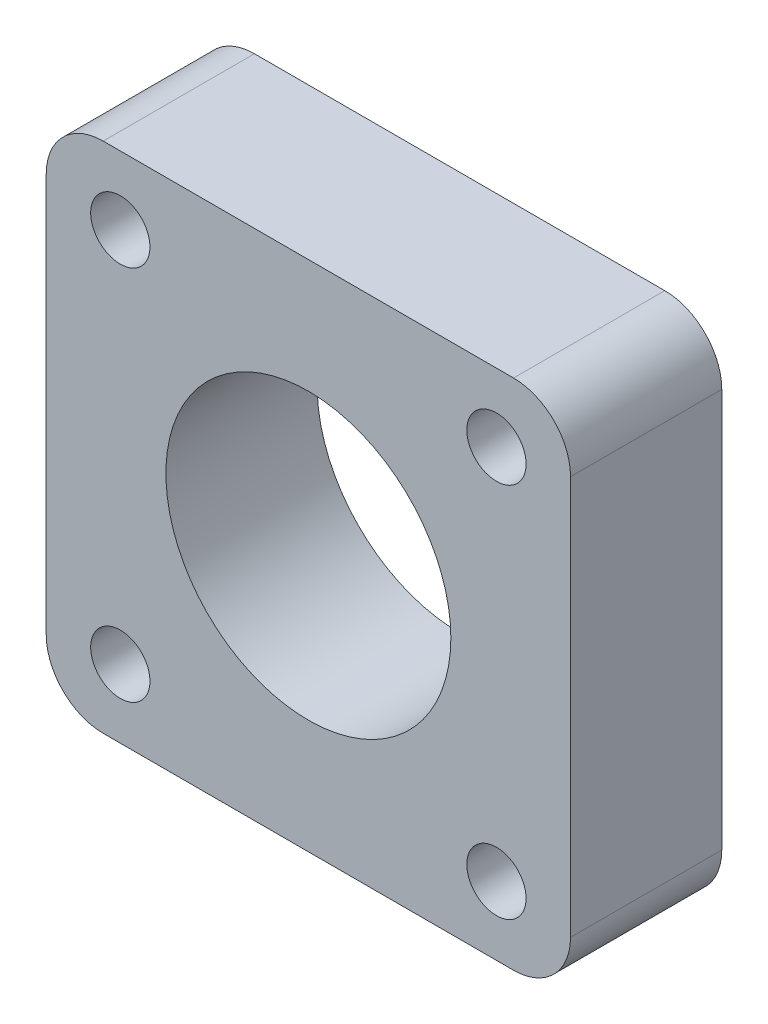
ISO-10303-21;
HEADER;
FILE_DESCRIPTION(('STEP AP214'),'2;1');
FILE_NAME('part.step','',(''),(''),'','','');
FILE_SCHEMA(('AUTOMOTIVE_DESIGN { 1 0 10303 214 1 1 1 1 }'));
ENDSEC;
DATA;
#1=APPLICATION_CONTEXT('core data for automotive mechanical design processes');
#2=APPLICATION_PROTOCOL_DEFINITION('international standard','automotive_design',2000,#1);
#3=PRODUCT_CONTEXT('',#1,'mechanical');
#4=PRODUCT('Part','Part','',(#3));
#5=PRODUCT_RELATED_PRODUCT_CATEGORY('part','',(#4));
#6=PRODUCT_DEFINITION_FORMATION('','',#4);
#7=PRODUCT_DEFINITION_CONTEXT('part definition',#1,'design');
#8=PRODUCT_DEFINITION('design','',#6,#7);
#9=PRODUCT_DEFINITION_SHAPE('','',#8);
#10=(LENGTH_UNIT() NAMED_UNIT(*) SI_UNIT(.MILLI.,.METRE.));
#11=(NAMED_UNIT(*) PLANE_ANGLE_UNIT() SI_UNIT($,.RADIAN.));
#12=(NAMED_UNIT(*) SI_UNIT($,.STERADIAN.) SOLID_ANGLE_UNIT());
#13=UNCERTAINTY_MEASURE_WITH_UNIT(LENGTH_MEASURE(1.E-05),#10,'distance_accuracy_value','');
#14=(GEOMETRIC_REPRESENTATION_CONTEXT(3) GLOBAL_UNCERTAINTY_ASSIGNED_CONTEXT((#13)) GLOBAL_UNIT_ASSIGNED_CONTEXT((#10,
#11,#12)) REPRESENTATION_CONTEXT('',''));
#15=CARTESIAN_POINT('',(0.,0.,0.));
#16=DIRECTION('',(0.,0.,1.));
#17=DIRECTION('',(1.,0.,0.));
#18=AXIS2_PLACEMENT_3D('',#15,#16,#17);
#19=CARTESIAN_POINT('',(119.085323537455,309.675869106646,114.350602172786));
#20=DIRECTION('',(0.,0.,-1.));
#21=DIRECTION('',(-1.,0.,0.));
#22=AXIS2_PLACEMENT_3D('',#19,#20,#21);
#23=CYLINDRICAL_SURFACE('',#22,5.);
#24=CARTESIAN_POINT('',(119.085323537455,309.675869106646,50.0000000000012));
#25=DIRECTION('',(0.,0.,1.));
#26=DIRECTION('',(1.,0.,0.));
#27=AXIS2_PLACEMENT_3D('',#24,#25,#26);
#28=CIRCLE('',#27,5.);
#29=CARTESIAN_POINT('',(119.085323537455,314.675869106646,50.0000000000012));
#30=VERTEX_POINT('',#29);
#31=CARTESIAN_POINT('',(114.085323537455,309.675869106646,50.0000000000012));
#32=VERTEX_POINT('',#31);
#33=EDGE_CURVE('E134',#30,#32,#28,.T.);
#34=ORIENTED_EDGE('',*,*,#33,.F.);
#35=DIRECTION('',(0.,0.,-1.));
#36=VECTOR('',#35,1.);
#37=CARTESIAN_POINT('',(119.085323537455,314.675869106646,114.350602172786));
#38=LINE('',#37,#36);
#39=CARTESIAN_POINT('',(119.085323537455,314.675869106646,36.7311472933851));
#40=VERTEX_POINT('',#39);
#41=EDGE_CURVE('E39',#30,#40,#38,.T.);
#42=ORIENTED_EDGE('',*,*,#41,.T.);
#43=CARTESIAN_POINT('',(119.085323537455,309.675869106646,36.7311472933851));
#44=DIRECTION('',(0.,0.,1.));
#45=DIRECTION('',(1.,0.,0.));
#46=AXIS2_PLACEMENT_3D('',#43,#44,#45);
#47=CIRCLE('',#46,5.);
#48=CARTESIAN_POINT('',(114.085323537455,309.675869106646,36.7311472933851));
#49=VERTEX_POINT('',#48);
#50=EDGE_CURVE('E142',#40,#49,#47,.T.);
#51=ORIENTED_EDGE('',*,*,#50,.T.);
#52=DIRECTION('',(0.,0.,-1.));
#53=VECTOR('',#52,1.);
#54=CARTESIAN_POINT('',(114.085323537455,309.675869106646,114.350602172786));
#55=LINE('',#54,#53);
#56=EDGE_CURVE('E90',#32,#49,#55,.T.);
#57=ORIENTED_EDGE('',*,*,#56,.F.);
#58=EDGE_LOOP('',(#34,#42,#51,#57));
#59=FACE_BOUND('',#58,.T.);
#60=ADVANCED_FACE('F35',(#59),#23,.T.);
#61=CARTESIAN_POINT('',(114.085323537455,309.675869106646,114.350602172786));
#62=DIRECTION('',(1.,0.,0.));
#63=DIRECTION('',(0.,1.,0.));
#64=AXIS2_PLACEMENT_3D('',#61,#62,#63);
#65=PLANE('',#64);
#66=DIRECTION('',(0.,-1.,0.));
#67=VECTOR('',#66,1.);
#68=CARTESIAN_POINT('',(114.085323537455,309.675869106646,50.0000000000012));
#69=LINE('',#68,#67);
#70=CARTESIAN_POINT('',(114.085323537454,274.675869106646,50.0000000000012));
#71=VERTEX_POINT('',#70);
#72=EDGE_CURVE('E97',#32,#71,#69,.T.);
#73=ORIENTED_EDGE('',*,*,#72,.F.);
#74=ORIENTED_EDGE('',*,*,#56,.T.);
#75=DIRECTION('',(0.,-1.,0.));
#76=VECTOR('',#75,1.);
#77=CARTESIAN_POINT('',(114.085323537455,309.675869106646,36.7311472933851));
#78=LINE('',#77,#76);
#79=CARTESIAN_POINT('',(114.085323537454,274.675869106646,36.7311472933851));
#80=VERTEX_POINT('',#79);
#81=EDGE_CURVE('E141',#49,#80,#78,.T.);
#82=ORIENTED_EDGE('',*,*,#81,.T.);
#83=DIRECTION('',(0.,0.,-1.));
#84=VECTOR('',#83,1.);
#85=CARTESIAN_POINT('',(114.085323537454,274.675869106646,114.350602172786));
#86=LINE('',#85,#84);
#87=EDGE_CURVE('E143',#71,#80,#86,.T.);
#88=ORIENTED_EDGE('',*,*,#87,.F.);
#89=EDGE_LOOP('',(#73,#74,#82,#88));
#90=FACE_BOUND('',#89,.T.);
#91=ADVANCED_FACE('F229',(#90),#65,.F.);
#92=CARTESIAN_POINT('',(119.085323537454,274.675869106646,114.350602172786));
#93=DIRECTION('',(0.,0.,-1.));
#94=DIRECTION('',(-1.,0.,0.));
#95=AXIS2_PLACEMENT_3D('',#92,#93,#94);
#96=CYLINDRICAL_SURFACE('',#95,5.);
#97=CARTESIAN_POINT('',(119.085323537454,274.675869106646,50.0000000000012));
#98=DIRECTION('',(0.,0.,1.));
#99=DIRECTION('',(1.,0.,0.));
#100=AXIS2_PLACEMENT_3D('',#97,#98,#99);
#101=CIRCLE('',#100,5.);
#102=CARTESIAN_POINT('',(119.085323537454,269.675869106646,50.0000000000011));
#103=VERTEX_POINT('',#102);
#104=EDGE_CURVE('E130',#71,#103,#101,.T.);
#105=ORIENTED_EDGE('',*,*,#104,.F.);
#106=ORIENTED_EDGE('',*,*,#87,.T.);
#107=CARTESIAN_POINT('',(119.085323537454,274.675869106646,36.7311472933851));
#108=DIRECTION('',(0.,0.,1.));
#109=DIRECTION('',(1.,0.,0.));
#110=AXIS2_PLACEMENT_3D('',#107,#108,#109);
#111=CIRCLE('',#110,5.);
#112=CARTESIAN_POINT('',(119.085323537454,269.675869106646,36.7311472933851));
#113=VERTEX_POINT('',#112);
#114=EDGE_CURVE('E145',#80,#113,#111,.T.);
#115=ORIENTED_EDGE('',*,*,#114,.T.);
#116=DIRECTION('',(0.,0.,-1.));
#117=VECTOR('',#116,1.);
#118=CARTESIAN_POINT('',(119.085323537454,269.675869106646,114.350602172786));
#119=LINE('',#118,#117);
#120=EDGE_CURVE('E146',#103,#113,#119,.T.);
#121=ORIENTED_EDGE('',*,*,#120,.F.);
#122=EDGE_LOOP('',(#105,#106,#115,#121));
#123=FACE_BOUND('',#122,.T.);
#124=ADVANCED_FACE('F235',(#123),#96,.T.);
#125=CARTESIAN_POINT('',(119.085323537454,269.675869106646,114.350602172786));
#126=DIRECTION('',(0.,1.,0.));
#127=DIRECTION('',(-1.,0.,0.));
#128=AXIS2_PLACEMENT_3D('',#125,#126,#127);
#129=PLANE('',#128);
#130=DIRECTION('',(1.,0.,0.));
#131=VECTOR('',#130,1.);
#132=CARTESIAN_POINT('',(119.085323537454,269.675869106646,50.0000000000012));
#133=LINE('',#132,#131);
#134=CARTESIAN_POINT('',(155.085323537454,269.675869106646,50.000000000001));
#135=VERTEX_POINT('',#134);
#136=EDGE_CURVE('E125',#103,#135,#133,.T.);
#137=ORIENTED_EDGE('',*,*,#136,.F.);
#138=ORIENTED_EDGE('',*,*,#120,.T.);
#139=DIRECTION('',(1.,0.,0.));
#140=VECTOR('',#139,1.);
#141=CARTESIAN_POINT('',(119.085323537454,269.675869106646,36.7311472933851));
#142=LINE('',#141,#140);
#143=CARTESIAN_POINT('',(155.085323537454,269.675869106646,36.7311472933851));
#144=VERTEX_POINT('',#143);
#145=EDGE_CURVE('E148',#113,#144,#142,.T.);
#146=ORIENTED_EDGE('',*,*,#145,.T.);
#147=DIRECTION('',(0.,0.,-1.));
#148=VECTOR('',#147,1.);
#149=CARTESIAN_POINT('',(155.085323537454,269.675869106646,114.350602172786));
#150=LINE('',#149,#148);
#151=EDGE_CURVE('E149',#135,#144,#150,.T.);
#152=ORIENTED_EDGE('',*,*,#151,.F.);
#153=EDGE_LOOP('',(#137,#138,#146,#152));
#154=FACE_BOUND('',#153,.T.);
#155=ADVANCED_FACE('F240',(#154),#129,.F.);
#156=CARTESIAN_POINT('',(155.085323537454,274.675869106646,114.350602172786));
#157=DIRECTION('',(0.,0.,-1.));
#158=DIRECTION('',(-1.,0.,0.));
#159=AXIS2_PLACEMENT_3D('',#156,#157,#158);
#160=CYLINDRICAL_SURFACE('',#159,5.);
#161=CARTESIAN_POINT('',(155.085323537454,274.675869106646,50.000000000001));
#162=DIRECTION('',(0.,0.,1.));
#163=DIRECTION('',(1.,0.,0.));
#164=AXIS2_PLACEMENT_3D('',#161,#162,#163);
#165=CIRCLE('',#164,5.);
#166=CARTESIAN_POINT('',(160.085323537454,274.675869106646,50.000000000001));
#167=VERTEX_POINT('',#166);
#168=EDGE_CURVE('E123',#135,#167,#165,.T.);
#169=ORIENTED_EDGE('',*,*,#168,.F.);
#170=ORIENTED_EDGE('',*,*,#151,.T.);
#171=CARTESIAN_POINT('',(155.085323537454,274.675869106646,36.7311472933851));
#172=DIRECTION('',(0.,0.,1.));
#173=DIRECTION('',(1.,0.,0.));
#174=AXIS2_PLACEMENT_3D('',#171,#172,#173);
#175=CIRCLE('',#174,5.);
#176=CARTESIAN_POINT('',(160.085323537454,274.675869106646,36.7311472933851));
#177=VERTEX_POINT('',#176);
#178=EDGE_CURVE('E151',#144,#177,#175,.T.);
#179=ORIENTED_EDGE('',*,*,#178,.T.);
#180=DIRECTION('',(0.,0.,-1.));
#181=VECTOR('',#180,1.);
#182=CARTESIAN_POINT('',(160.085323537454,274.675869106646,114.350602172786));
#183=LINE('',#182,#181);
#184=EDGE_CURVE('E152',#167,#177,#183,.T.);
#185=ORIENTED_EDGE('',*,*,#184,.F.);
#186=EDGE_LOOP('',(#169,#170,#179,#185));
#187=FACE_BOUND('',#186,.T.);
#188=ADVANCED_FACE('F243',(#187),#160,.T.);
#189=CARTESIAN_POINT('',(160.085323537454,274.675869106646,114.350602172786));
#190=DIRECTION('',(-1.,0.,0.));
#191=DIRECTION('',(0.,-1.,0.));
#192=AXIS2_PLACEMENT_3D('',#189,#190,#191);
#193=PLANE('',#192);
#194=DIRECTION('',(0.,1.,0.));
#195=VECTOR('',#194,1.);
#196=CARTESIAN_POINT('',(160.085323537454,274.675869106646,50.000000000001));
#197=LINE('',#196,#195);
#198=CARTESIAN_POINT('',(160.085323537455,309.675869106646,50.000000000001));
#199=VERTEX_POINT('',#198);
#200=EDGE_CURVE('E44',#167,#199,#197,.T.);
#201=ORIENTED_EDGE('',*,*,#200,.F.);
#202=ORIENTED_EDGE('',*,*,#184,.T.);
#203=DIRECTION('',(0.,1.,0.));
#204=VECTOR('',#203,1.);
#205=CARTESIAN_POINT('',(160.085323537454,274.675869106646,36.7311472933851));
#206=LINE('',#205,#204);
#207=CARTESIAN_POINT('',(160.085323537455,309.675869106646,36.7311472933851));
#208=VERTEX_POINT('',#207);
#209=EDGE_CURVE('E117',#177,#208,#206,.T.);
#210=ORIENTED_EDGE('',*,*,#209,.T.);
#211=DIRECTION('',(0.,0.,-1.));
#212=VECTOR('',#211,1.);
#213=CARTESIAN_POINT('',(160.085323537455,309.675869106646,114.350602172786));
#214=LINE('',#213,#212);
#215=EDGE_CURVE('E108',#199,#208,#214,.T.);
#216=ORIENTED_EDGE('',*,*,#215,.F.);
#217=EDGE_LOOP('',(#201,#202,#210,#216));
#218=FACE_BOUND('',#217,.T.);
#219=ADVANCED_FACE('F114',(#218),#193,.F.);
#220=CARTESIAN_POINT('',(155.085323537455,309.675869106646,114.350602172786));
#221=DIRECTION('',(0.,0.,-1.));
#222=DIRECTION('',(-1.,0.,0.));
#223=AXIS2_PLACEMENT_3D('',#220,#221,#222);
#224=CYLINDRICAL_SURFACE('',#223,5.);
#225=CARTESIAN_POINT('',(155.085323537455,309.675869106646,50.000000000001));
#226=DIRECTION('',(0.,0.,1.));
#227=DIRECTION('',(1.,0.,0.));
#228=AXIS2_PLACEMENT_3D('',#225,#226,#227);
#229=CIRCLE('',#228,5.);
#230=CARTESIAN_POINT('',(155.085323537455,314.675869106646,50.0000000000011));
#231=VERTEX_POINT('',#230);
#232=EDGE_CURVE('E11',#199,#231,#229,.T.);
#233=ORIENTED_EDGE('',*,*,#232,.F.);
#234=ORIENTED_EDGE('',*,*,#215,.T.);
#235=CARTESIAN_POINT('',(155.085323537455,309.675869106646,36.7311472933851));
#236=DIRECTION('',(0.,0.,1.));
#237=DIRECTION('',(1.,0.,0.));
#238=AXIS2_PLACEMENT_3D('',#235,#236,#237);
#239=CIRCLE('',#238,5.);
#240=CARTESIAN_POINT('',(155.085323537455,314.675869106646,36.7311472933851));
#241=VERTEX_POINT('',#240);
#242=EDGE_CURVE('E119',#208,#241,#239,.T.);
#243=ORIENTED_EDGE('',*,*,#242,.T.);
#244=DIRECTION('',(0.,0.,-1.));
#245=VECTOR('',#244,1.);
#246=CARTESIAN_POINT('',(155.085323537455,314.675869106646,114.350602172786));
#247=LINE('',#246,#245);
#248=EDGE_CURVE('E57',#231,#241,#247,.T.);
#249=ORIENTED_EDGE('',*,*,#248,.F.);
#250=EDGE_LOOP('',(#233,#234,#243,#249));
#251=FACE_BOUND('',#250,.T.);
#252=ADVANCED_FACE('F107',(#251),#224,.T.);
#253=CARTESIAN_POINT('',(155.085323537455,314.675869106646,114.350602172786));
#254=DIRECTION('',(0.,-1.,0.));
#255=DIRECTION('',(1.,0.,0.));
#256=AXIS2_PLACEMENT_3D('',#253,#254,#255);
#257=PLANE('',#256);
#258=DIRECTION('',(-1.,0.,0.));
#259=VECTOR('',#258,1.);
#260=CARTESIAN_POINT('',(155.085323537455,314.675869106646,50.000000000001));
#261=LINE('',#260,#259);
#262=EDGE_CURVE('E137',#231,#30,#261,.T.);
#263=ORIENTED_EDGE('',*,*,#262,.F.);
#264=ORIENTED_EDGE('',*,*,#248,.T.);
#265=DIRECTION('',(-1.,0.,0.));
#266=VECTOR('',#265,1.);
#267=CARTESIAN_POINT('',(155.085323537455,314.675869106646,36.7311472933851));
#268=LINE('',#267,#266);
#269=EDGE_CURVE('E139',#241,#40,#268,.T.);
#270=ORIENTED_EDGE('',*,*,#269,.T.);
#271=ORIENTED_EDGE('',*,*,#41,.F.);
#272=EDGE_LOOP('',(#263,#264,#270,#271));
#273=FACE_BOUND('',#272,.T.);
#274=ADVANCED_FACE('F224',(#273),#257,.F.);
#275=CARTESIAN_POINT('',(119.085323537455,309.675869106646,36.7311472933851));
#276=DIRECTION('',(0.,0.,1.));
#277=DIRECTION('',(1.,0.,0.));
#278=AXIS2_PLACEMENT_3D('',#275,#276,#277);
#279=PLANE('',#278);
#280=CARTESIAN_POINT('',(137.085323537455,292.175869106646,36.7311472933851));
#281=DIRECTION('',(0.,0.,1.));
#282=DIRECTION('',(1.,0.,0.));
#283=AXIS2_PLACEMENT_3D('',#280,#281,#282);
#284=CIRCLE('',#283,12.5);
#285=CARTESIAN_POINT('',(149.585323537455,292.175869106646,36.7311472933851));
#286=VERTEX_POINT('',#285);
#287=EDGE_CURVE('E190',#286,#286,#284,.T.);
#288=ORIENTED_EDGE('',*,*,#287,.T.);
#289=EDGE_LOOP('',(#288));
#290=FACE_BOUND('',#289,.T.);
#291=CARTESIAN_POINT('',(153.585323537455,275.675869106646,36.7311472933851));
#292=DIRECTION('',(0.,0.,1.));
#293=DIRECTION('',(1.,0.,0.));
#294=AXIS2_PLACEMENT_3D('',#291,#292,#293);
#295=CIRCLE('',#294,2.59999999999999);
#296=CARTESIAN_POINT('',(156.185323537455,275.675869106646,36.7311472933851));
#297=VERTEX_POINT('',#296);
#298=EDGE_CURVE('E168',#297,#297,#295,.T.);
#299=ORIENTED_EDGE('',*,*,#298,.T.);
#300=EDGE_LOOP('',(#299));
#301=FACE_BOUND('',#300,.T.);
#302=CARTESIAN_POINT('',(120.585323537455,275.675869106646,36.7311472933851));
#303=DIRECTION('',(0.,0.,1.));
#304=DIRECTION('',(1.,0.,0.));
#305=AXIS2_PLACEMENT_3D('',#302,#303,#304);
#306=CIRCLE('',#305,2.59999999999993);
#307=CARTESIAN_POINT('',(123.185323537455,275.675869106646,36.7311472933851));
#308=VERTEX_POINT('',#307);
#309=EDGE_CURVE('E170',#308,#308,#306,.T.);
#310=ORIENTED_EDGE('',*,*,#309,.T.);
#311=EDGE_LOOP('',(#310));
#312=FACE_BOUND('',#311,.T.);
#313=CARTESIAN_POINT('',(120.585323537455,308.675869106646,36.7311472933851));
#314=DIRECTION('',(0.,0.,1.));
#315=DIRECTION('',(1.,0.,0.));
#316=AXIS2_PLACEMENT_3D('',#313,#314,#315);
#317=CIRCLE('',#316,2.59999999999999);
#318=CARTESIAN_POINT('',(123.185323537455,308.675869106646,36.7311472933851));
#319=VERTEX_POINT('',#318);
#320=EDGE_CURVE('E174',#319,#319,#317,.T.);
#321=ORIENTED_EDGE('',*,*,#320,.T.);
#322=EDGE_LOOP('',(#321));
#323=FACE_BOUND('',#322,.T.);
#324=CARTESIAN_POINT('',(153.585323537455,308.675869106646,36.7311472933851));
#325=DIRECTION('',(0.,0.,1.));
#326=DIRECTION('',(1.,0.,0.));
#327=AXIS2_PLACEMENT_3D('',#324,#325,#326);
#328=CIRCLE('',#327,2.59999999999993);
#329=CARTESIAN_POINT('',(156.185323537455,308.675869106646,36.7311472933851));
#330=VERTEX_POINT('',#329);
#331=EDGE_CURVE('E179',#330,#330,#328,.T.);
#332=ORIENTED_EDGE('',*,*,#331,.T.);
#333=EDGE_LOOP('',(#332));
#334=FACE_BOUND('',#333,.T.);
#335=ORIENTED_EDGE('',*,*,#50,.F.);
#336=ORIENTED_EDGE('',*,*,#269,.F.);
#337=ORIENTED_EDGE('',*,*,#242,.F.);
#338=ORIENTED_EDGE('',*,*,#209,.F.);
#339=ORIENTED_EDGE('',*,*,#178,.F.);
#340=ORIENTED_EDGE('',*,*,#145,.F.);
#341=ORIENTED_EDGE('',*,*,#114,.F.);
#342=ORIENTED_EDGE('',*,*,#81,.F.);
#343=EDGE_LOOP('',(#335,#336,#337,#338,#339,#340,#341,#342));
#344=FACE_BOUND('',#343,.T.);
#345=ADVANCED_FACE('F207',(#290,#301,#312,#323,#334,#344),#279,.F.);
#346=CARTESIAN_POINT('',(52.0853235374547,128.675869106646,50.0000000000014));
#347=DIRECTION('',(0.,0.,1.));
#348=DIRECTION('',(0.,-1.,0.));
#349=AXIS2_PLACEMENT_3D('',#346,#347,#348);
#350=PLANE('',#349);
#351=CARTESIAN_POINT('',(137.085323537455,292.175869106646,50.0000000000016));
#352=DIRECTION('',(0.,0.,1.));
#353=DIRECTION('',(1.,0.,0.));
#354=AXIS2_PLACEMENT_3D('',#351,#352,#353);
#355=CIRCLE('',#354,12.5);
#356=CARTESIAN_POINT('',(149.585323537455,292.175869106646,50.0000000000016));
#357=VERTEX_POINT('',#356);
#358=EDGE_CURVE('E197',#357,#357,#355,.T.);
#359=ORIENTED_EDGE('',*,*,#358,.F.);
#360=EDGE_LOOP('',(#359));
#361=FACE_BOUND('',#360,.T.);
#362=CARTESIAN_POINT('',(153.585323537455,275.675869106646,50.0000000000016));
#363=DIRECTION('',(0.,0.,1.));
#364=DIRECTION('',(1.,0.,0.));
#365=AXIS2_PLACEMENT_3D('',#362,#363,#364);
#366=CIRCLE('',#365,2.59999999999999);
#367=CARTESIAN_POINT('',(156.185323537455,275.675869106646,50.0000000000016));
#368=VERTEX_POINT('',#367);
#369=EDGE_CURVE('E186',#368,#368,#366,.T.);
#370=ORIENTED_EDGE('',*,*,#369,.F.);
#371=EDGE_LOOP('',(#370));
#372=FACE_BOUND('',#371,.T.);
#373=CARTESIAN_POINT('',(120.585323537455,275.675869106646,50.0000000000016));
#374=DIRECTION('',(0.,0.,1.));
#375=DIRECTION('',(1.,0.,0.));
#376=AXIS2_PLACEMENT_3D('',#373,#374,#375);
#377=CIRCLE('',#376,2.59999999999993);
#378=CARTESIAN_POINT('',(123.185323537455,275.675869106646,50.0000000000016));
#379=VERTEX_POINT('',#378);
#380=EDGE_CURVE('E189',#379,#379,#377,.T.);
#381=ORIENTED_EDGE('',*,*,#380,.F.);
#382=EDGE_LOOP('',(#381));
#383=FACE_BOUND('',#382,.T.);
#384=CARTESIAN_POINT('',(120.585323537455,308.675869106646,50.0000000000016));
#385=DIRECTION('',(0.,0.,1.));
#386=DIRECTION('',(1.,0.,0.));
#387=AXIS2_PLACEMENT_3D('',#384,#385,#386);
#388=CIRCLE('',#387,2.59999999999999);
#389=CARTESIAN_POINT('',(123.185323537455,308.675869106646,50.0000000000016));
#390=VERTEX_POINT('',#389);
#391=EDGE_CURVE('E185',#390,#390,#388,.T.);
#392=ORIENTED_EDGE('',*,*,#391,.F.);
#393=EDGE_LOOP('',(#392));
#394=FACE_BOUND('',#393,.T.);
#395=CARTESIAN_POINT('',(153.585323537455,308.675869106646,50.0000000000016));
#396=DIRECTION('',(0.,0.,1.));
#397=DIRECTION('',(1.,0.,0.));
#398=AXIS2_PLACEMENT_3D('',#395,#396,#397);
#399=CIRCLE('',#398,2.59999999999993);
#400=CARTESIAN_POINT('',(156.185323537455,308.675869106646,50.0000000000016));
#401=VERTEX_POINT('',#400);
#402=EDGE_CURVE('E182',#401,#401,#399,.T.);
#403=ORIENTED_EDGE('',*,*,#402,.F.);
#404=EDGE_LOOP('',(#403));
#405=FACE_BOUND('',#404,.T.);
#406=ORIENTED_EDGE('',*,*,#262,.T.);
#407=ORIENTED_EDGE('',*,*,#33,.T.);
#408=ORIENTED_EDGE('',*,*,#72,.T.);
#409=ORIENTED_EDGE('',*,*,#104,.T.);
#410=ORIENTED_EDGE('',*,*,#136,.T.);
#411=ORIENTED_EDGE('',*,*,#168,.T.);
#412=ORIENTED_EDGE('',*,*,#200,.T.);
#413=ORIENTED_EDGE('',*,*,#232,.T.);
#414=EDGE_LOOP('',(#406,#407,#408,#409,#410,#411,#412,#413));
#415=FACE_BOUND('',#414,.T.);
#416=ADVANCED_FACE('F37',(#361,#372,#383,#394,#405,#415),#350,.T.);
#417=CARTESIAN_POINT('',(153.585323537455,308.675869106646,20.0000000000016));
#418=DIRECTION('',(0.,0.,1.));
#419=DIRECTION('',(1.,0.,0.));
#420=AXIS2_PLACEMENT_3D('',#417,#418,#419);
#421=CYLINDRICAL_SURFACE('',#420,2.59999999999993);
#422=CARTESIAN_POINT('',(156.185323537455,308.675869106646,50.0000000000016));
#423=CARTESIAN_POINT('',(156.185323537455,308.675869106646,49.8617827843077));
#424=CARTESIAN_POINT('',(156.185323537455,308.675869106646,49.7235655686138));
#425=CARTESIAN_POINT('',(156.185323537455,308.675869106646,49.4471311372259));
#426=CARTESIAN_POINT('',(156.185323537455,308.675869106646,49.308913921532));
#427=CARTESIAN_POINT('',(156.185323537455,308.675869106646,49.0324794901442));
#428=CARTESIAN_POINT('',(156.185323537455,308.675869106646,48.8942622744503));
#429=CARTESIAN_POINT('',(156.185323537455,308.675869106646,48.6178278430624));
#430=CARTESIAN_POINT('',(156.185323537455,308.675869106646,48.4796106273685));
#431=CARTESIAN_POINT('',(156.185323537455,308.675869106646,48.2031761959806));
#432=CARTESIAN_POINT('',(156.185323537455,308.675869106646,48.0649589802867));
#433=CARTESIAN_POINT('',(156.185323537455,308.675869106646,47.7885245488989));
#434=CARTESIAN_POINT('',(156.185323537455,308.675869106646,47.650307333205));
#435=CARTESIAN_POINT('',(156.185323537455,308.675869106646,47.3738729018171));
#436=CARTESIAN_POINT('',(156.185323537455,308.675869106646,47.2356556861232));
#437=CARTESIAN_POINT('',(156.185323537455,308.675869106646,46.9592212547353));
#438=CARTESIAN_POINT('',(156.185323537455,308.675869106646,46.8210040390414));
#439=CARTESIAN_POINT('',(156.185323537455,308.675869106646,46.5445696076536));
#440=CARTESIAN_POINT('',(156.185323537455,308.675869106646,46.4063523919597));
#441=CARTESIAN_POINT('',(156.185323537455,308.675869106646,46.1299179605718));
#442=CARTESIAN_POINT('',(156.185323537455,308.675869106646,45.9917007448779));
#443=CARTESIAN_POINT('',(156.185323537455,308.675869106646,45.71526631349));
#444=CARTESIAN_POINT('',(156.185323537455,308.675869106646,45.5770490977961));
#445=CARTESIAN_POINT('',(156.185323537455,308.675869106646,45.3006146664083));
#446=CARTESIAN_POINT('',(156.185323537455,308.675869106646,45.1623974507144));
#447=CARTESIAN_POINT('',(156.185323537455,308.675869106646,44.8859630193265));
#448=CARTESIAN_POINT('',(156.185323537455,308.675869106646,44.7477458036326));
#449=CARTESIAN_POINT('',(156.185323537455,308.675869106646,44.4713113722448));
#450=CARTESIAN_POINT('',(156.185323537455,308.675869106646,44.3330941565508));
#451=CARTESIAN_POINT('',(156.185323537455,308.675869106646,44.056659725163));
#452=CARTESIAN_POINT('',(156.185323537455,308.675869106646,43.9184425094691));
#453=CARTESIAN_POINT('',(156.185323537455,308.675869106646,43.6420080780812));
#454=CARTESIAN_POINT('',(156.185323537455,308.675869106646,43.5037908623873));
#455=CARTESIAN_POINT('',(156.185323537455,308.675869106646,43.2273564309994));
#456=CARTESIAN_POINT('',(156.185323537455,308.675869106646,43.0891392153055));
#457=CARTESIAN_POINT('',(156.185323537455,308.675869106646,42.8127047839177));
#458=CARTESIAN_POINT('',(156.185323537455,308.675869106646,42.6744875682238));
#459=CARTESIAN_POINT('',(156.185323537455,308.675869106646,42.3980531368359));
#460=CARTESIAN_POINT('',(156.185323537455,308.675869106646,42.259835921142));
#461=CARTESIAN_POINT('',(156.185323537455,308.675869106646,41.9834014897542));
#462=CARTESIAN_POINT('',(156.185323537455,308.675869106646,41.8451842740602));
#463=CARTESIAN_POINT('',(156.185323537455,308.675869106646,41.5687498426724));
#464=CARTESIAN_POINT('',(156.185323537455,308.675869106646,41.4305326269785));
#465=CARTESIAN_POINT('',(156.185323537455,308.675869106646,41.1540981955906));
#466=CARTESIAN_POINT('',(156.185323537455,308.675869106646,41.0158809798967));
#467=CARTESIAN_POINT('',(156.185323537455,308.675869106646,40.7394465485089));
#468=CARTESIAN_POINT('',(156.185323537455,308.675869106646,40.6012293328149));
#469=CARTESIAN_POINT('',(156.185323537455,308.675869106646,40.3247949014271));
#470=CARTESIAN_POINT('',(156.185323537455,308.675869106646,40.1865776857332));
#471=CARTESIAN_POINT('',(156.185323537455,308.675869106646,39.9101432543453));
#472=CARTESIAN_POINT('',(156.185323537455,308.675869106646,39.7719260386514));
#473=CARTESIAN_POINT('',(156.185323537455,308.675869106646,39.4954916072636));
#474=CARTESIAN_POINT('',(156.185323537455,308.675869106646,39.3572743915696));
#475=CARTESIAN_POINT('',(156.185323537455,308.675869106646,39.0808399601818));
#476=CARTESIAN_POINT('',(156.185323537455,308.675869106646,38.9426227444879));
#477=CARTESIAN_POINT('',(156.185323537455,308.675869106646,38.6661883131));
#478=CARTESIAN_POINT('',(156.185323537455,308.675869106646,38.5279710974061));
#479=CARTESIAN_POINT('',(156.185323537455,308.675869106646,38.2515366660183));
#480=CARTESIAN_POINT('',(156.185323537455,308.675869106646,38.1133194503243));
#481=CARTESIAN_POINT('',(156.185323537455,308.675869106646,37.8368850189365));
#482=CARTESIAN_POINT('',(156.185323537455,308.675869106646,37.6986678032426));
#483=CARTESIAN_POINT('',(156.185323537455,308.675869106646,37.4222333718547));
#484=CARTESIAN_POINT('',(156.185323537455,308.675869106646,37.2840161561608));
#485=CARTESIAN_POINT('',(156.185323537455,308.675869106646,37.007581724773));
#486=CARTESIAN_POINT('',(156.185323537455,308.675869106646,36.869364509079));
#487=CARTESIAN_POINT('',(156.185323537455,308.675869106646,36.7311472933851));
#488=B_SPLINE_CURVE_WITH_KNOTS('',3,(#422,#423,#424,#425,#426,#427,#428,#429,#430,#431,#432,
#433,#434,#435,#436,#437,#438,#439,#440,#441,#442,#443,#444,#445,#446,#447,#448,#449,#450,#451,
#452,#453,#454,#455,#456,#457,#458,#459,#460,#461,#462,#463,#464,#465,#466,#467,#468,#469,#470,
#471,#472,#473,#474,#475,#476,#477,#478,#479,#480,#481,#482,#483,#484,#485,#486,#487),
.UNSPECIFIED.,.F.,.F.,(4,2,2,2,2,2,2,2,2,2,2,2,2,2,2,2,2,2,2,2,2,2,2,2,2,2,2,2,2,2,2,2,4),(0.,
0.414651647081765,0.82930329416353,1.2439549412453,1.65860658832707,2.07325823540883,
2.4879098824906,2.90256152957236,3.31721317665413,3.73186482373589,4.14651647081766,
4.56116811789942,4.97581976498119,5.39047141206295,5.80512305914473,6.21977470622649,
6.63442635330826,7.04907800039002,7.46372964747179,7.87838129455356,8.29303294163532,
8.70768458871709,9.12233623579885,9.53698788288062,9.95163952996239,10.3662911770442,
10.7809428241259,11.1955944712077,11.6102461182894,12.0248977653712,12.439549412453,
12.8542010595347,13.2688527066165),.UNSPECIFIED.);
#489=EDGE_CURVE('BSEAM206',#401,#330,#488,.T.);
#490=ORIENTED_EDGE('',*,*,#402,.T.);
#491=ORIENTED_EDGE('',*,*,#331,.F.);
#492=ORIENTED_EDGE('',*,*,#489,.T.);
#493=ORIENTED_EDGE('',*,*,#489,.F.);
#494=EDGE_LOOP('',(#490,#492,#491,#493));
#495=FACE_BOUND('',#494,.T.);
#496=ADVANCED_FACE('F206',(#495),#421,.F.);
#497=CARTESIAN_POINT('',(120.585323537455,308.675869106646,20.0000000000016));
#498=DIRECTION('',(0.,0.,1.));
#499=DIRECTION('',(1.,0.,0.));
#500=AXIS2_PLACEMENT_3D('',#497,#498,#499);
#501=CYLINDRICAL_SURFACE('',#500,2.59999999999999);
#502=CARTESIAN_POINT('',(123.185323537455,308.675869106646,50.0000000000016));
#503=CARTESIAN_POINT('',(123.185323537455,308.675869106646,49.8617827843077));
#504=CARTESIAN_POINT('',(123.185323537455,308.675869106646,49.7235655686138));
#505=CARTESIAN_POINT('',(123.185323537455,308.675869106646,49.4471311372259));
#506=CARTESIAN_POINT('',(123.185323537455,308.675869106646,49.308913921532));
#507=CARTESIAN_POINT('',(123.185323537455,308.675869106646,49.0324794901442));
#508=CARTESIAN_POINT('',(123.185323537455,308.675869106646,48.8942622744503));
#509=CARTESIAN_POINT('',(123.185323537455,308.675869106646,48.6178278430624));
#510=CARTESIAN_POINT('',(123.185323537455,308.675869106646,48.4796106273685));
#511=CARTESIAN_POINT('',(123.185323537455,308.675869106646,48.2031761959806));
#512=CARTESIAN_POINT('',(123.185323537455,308.675869106646,48.0649589802867));
#513=CARTESIAN_POINT('',(123.185323537455,308.675869106646,47.7885245488989));
#514=CARTESIAN_POINT('',(123.185323537455,308.675869106646,47.650307333205));
#515=CARTESIAN_POINT('',(123.185323537455,308.675869106646,47.3738729018171));
#516=CARTESIAN_POINT('',(123.185323537455,308.675869106646,47.2356556861232));
#517=CARTESIAN_POINT('',(123.185323537455,308.675869106646,46.9592212547353));
#518=CARTESIAN_POINT('',(123.185323537455,308.675869106646,46.8210040390414));
#519=CARTESIAN_POINT('',(123.185323537455,308.675869106646,46.5445696076536));
#520=CARTESIAN_POINT('',(123.185323537455,308.675869106646,46.4063523919597));
#521=CARTESIAN_POINT('',(123.185323537455,308.675869106646,46.1299179605718));
#522=CARTESIAN_POINT('',(123.185323537455,308.675869106646,45.9917007448779));
#523=CARTESIAN_POINT('',(123.185323537455,308.675869106646,45.71526631349));
#524=CARTESIAN_POINT('',(123.185323537455,308.675869106646,45.5770490977961));
#525=CARTESIAN_POINT('',(123.185323537455,308.675869106646,45.3006146664083));
#526=CARTESIAN_POINT('',(123.185323537455,308.675869106646,45.1623974507144));
#527=CARTESIAN_POINT('',(123.185323537455,308.675869106646,44.8859630193265));
#528=CARTESIAN_POINT('',(123.185323537455,308.675869106646,44.7477458036326));
#529=CARTESIAN_POINT('',(123.185323537455,308.675869106646,44.4713113722448));
#530=CARTESIAN_POINT('',(123.185323537455,308.675869106646,44.3330941565508));
#531=CARTESIAN_POINT('',(123.185323537455,308.675869106646,44.056659725163));
#532=CARTESIAN_POINT('',(123.185323537455,308.675869106646,43.9184425094691));
#533=CARTESIAN_POINT('',(123.185323537455,308.675869106646,43.6420080780812));
#534=CARTESIAN_POINT('',(123.185323537455,308.675869106646,43.5037908623873));
#535=CARTESIAN_POINT('',(123.185323537455,308.675869106646,43.2273564309994));
#536=CARTESIAN_POINT('',(123.185323537455,308.675869106646,43.0891392153055));
#537=CARTESIAN_POINT('',(123.185323537455,308.675869106646,42.8127047839177));
#538=CARTESIAN_POINT('',(123.185323537455,308.675869106646,42.6744875682238));
#539=CARTESIAN_POINT('',(123.185323537455,308.675869106646,42.3980531368359));
#540=CARTESIAN_POINT('',(123.185323537455,308.675869106646,42.259835921142));
#541=CARTESIAN_POINT('',(123.185323537455,308.675869106646,41.9834014897542));
#542=CARTESIAN_POINT('',(123.185323537455,308.675869106646,41.8451842740602));
#543=CARTESIAN_POINT('',(123.185323537455,308.675869106646,41.5687498426724));
#544=CARTESIAN_POINT('',(123.185323537455,308.675869106646,41.4305326269785));
#545=CARTESIAN_POINT('',(123.185323537455,308.675869106646,41.1540981955906));
#546=CARTESIAN_POINT('',(123.185323537455,308.675869106646,41.0158809798967));
#547=CARTESIAN_POINT('',(123.185323537455,308.675869106646,40.7394465485089));
#548=CARTESIAN_POINT('',(123.185323537455,308.675869106646,40.6012293328149));
#549=CARTESIAN_POINT('',(123.185323537455,308.675869106646,40.3247949014271));
#550=CARTESIAN_POINT('',(123.185323537455,308.675869106646,40.1865776857332));
#551=CARTESIAN_POINT('',(123.185323537455,308.675869106646,39.9101432543453));
#552=CARTESIAN_POINT('',(123.185323537455,308.675869106646,39.7719260386514));
#553=CARTESIAN_POINT('',(123.185323537455,308.675869106646,39.4954916072636));
#554=CARTESIAN_POINT('',(123.185323537455,308.675869106646,39.3572743915696));
#555=CARTESIAN_POINT('',(123.185323537455,308.675869106646,39.0808399601818));
#556=CARTESIAN_POINT('',(123.185323537455,308.675869106646,38.9426227444879));
#557=CARTESIAN_POINT('',(123.185323537455,308.675869106646,38.6661883131));
#558=CARTESIAN_POINT('',(123.185323537455,308.675869106646,38.5279710974061));
#559=CARTESIAN_POINT('',(123.185323537455,308.675869106646,38.2515366660183));
#560=CARTESIAN_POINT('',(123.185323537455,308.675869106646,38.1133194503243));
#561=CARTESIAN_POINT('',(123.185323537455,308.675869106646,37.8368850189365));
#562=CARTESIAN_POINT('',(123.185323537455,308.675869106646,37.6986678032426));
#563=CARTESIAN_POINT('',(123.185323537455,308.675869106646,37.4222333718547));
#564=CARTESIAN_POINT('',(123.185323537455,308.675869106646,37.2840161561608));
#565=CARTESIAN_POINT('',(123.185323537455,308.675869106646,37.007581724773));
#566=CARTESIAN_POINT('',(123.185323537455,308.675869106646,36.869364509079));
#567=CARTESIAN_POINT('',(123.185323537455,308.675869106646,36.7311472933851));
#568=B_SPLINE_CURVE_WITH_KNOTS('',3,(#502,#503,#504,#505,#506,#507,#508,#509,#510,#511,#512,
#513,#514,#515,#516,#517,#518,#519,#520,#521,#522,#523,#524,#525,#526,#527,#528,#529,#530,#531,
#532,#533,#534,#535,#536,#537,#538,#539,#540,#541,#542,#543,#544,#545,#546,#547,#548,#549,#550,
#551,#552,#553,#554,#555,#556,#557,#558,#559,#560,#561,#562,#563,#564,#565,#566,#567),
.UNSPECIFIED.,.F.,.F.,(4,2,2,2,2,2,2,2,2,2,2,2,2,2,2,2,2,2,2,2,2,2,2,2,2,2,2,2,2,2,2,2,4),(0.,
0.414651647081765,0.82930329416353,1.2439549412453,1.65860658832707,2.07325823540883,
2.4879098824906,2.90256152957236,3.31721317665413,3.73186482373589,4.14651647081766,
4.56116811789942,4.97581976498119,5.39047141206295,5.80512305914473,6.21977470622649,
6.63442635330826,7.04907800039002,7.46372964747179,7.87838129455356,8.29303294163532,
8.70768458871709,9.12233623579885,9.53698788288062,9.95163952996239,10.3662911770442,
10.7809428241259,11.1955944712077,11.6102461182894,12.0248977653712,12.439549412453,
12.8542010595347,13.2688527066165),.UNSPECIFIED.);
#569=EDGE_CURVE('BSEAM218',#390,#319,#568,.T.);
#570=ORIENTED_EDGE('',*,*,#391,.T.);
#571=ORIENTED_EDGE('',*,*,#320,.F.);
#572=ORIENTED_EDGE('',*,*,#569,.T.);
#573=ORIENTED_EDGE('',*,*,#569,.F.);
#574=EDGE_LOOP('',(#570,#572,#571,#573));
#575=FACE_BOUND('',#574,.T.);
#576=ADVANCED_FACE('F218',(#575),#501,.F.);
#577=CARTESIAN_POINT('',(120.585323537455,275.675869106646,20.0000000000016));
#578=DIRECTION('',(0.,0.,1.));
#579=DIRECTION('',(1.,0.,0.));
#580=AXIS2_PLACEMENT_3D('',#577,#578,#579);
#581=CYLINDRICAL_SURFACE('',#580,2.59999999999993);
#582=CARTESIAN_POINT('',(123.185323537455,275.675869106646,50.0000000000016));
#583=CARTESIAN_POINT('',(123.185323537455,275.675869106646,49.8617827843077));
#584=CARTESIAN_POINT('',(123.185323537455,275.675869106646,49.7235655686138));
#585=CARTESIAN_POINT('',(123.185323537455,275.675869106646,49.4471311372259));
#586=CARTESIAN_POINT('',(123.185323537455,275.675869106646,49.308913921532));
#587=CARTESIAN_POINT('',(123.185323537455,275.675869106646,49.0324794901442));
#588=CARTESIAN_POINT('',(123.185323537455,275.675869106646,48.8942622744503));
#589=CARTESIAN_POINT('',(123.185323537455,275.675869106646,48.6178278430624));
#590=CARTESIAN_POINT('',(123.185323537455,275.675869106646,48.4796106273685));
#591=CARTESIAN_POINT('',(123.185323537455,275.675869106646,48.2031761959806));
#592=CARTESIAN_POINT('',(123.185323537455,275.675869106646,48.0649589802867));
#593=CARTESIAN_POINT('',(123.185323537455,275.675869106646,47.7885245488989));
#594=CARTESIAN_POINT('',(123.185323537455,275.675869106646,47.650307333205));
#595=CARTESIAN_POINT('',(123.185323537455,275.675869106646,47.3738729018171));
#596=CARTESIAN_POINT('',(123.185323537455,275.675869106646,47.2356556861232));
#597=CARTESIAN_POINT('',(123.185323537455,275.675869106646,46.9592212547353));
#598=CARTESIAN_POINT('',(123.185323537455,275.675869106646,46.8210040390414));
#599=CARTESIAN_POINT('',(123.185323537455,275.675869106646,46.5445696076536));
#600=CARTESIAN_POINT('',(123.185323537455,275.675869106646,46.4063523919597));
#601=CARTESIAN_POINT('',(123.185323537455,275.675869106646,46.1299179605718));
#602=CARTESIAN_POINT('',(123.185323537455,275.675869106646,45.9917007448779));
#603=CARTESIAN_POINT('',(123.185323537455,275.675869106646,45.71526631349));
#604=CARTESIAN_POINT('',(123.185323537455,275.675869106646,45.5770490977961));
#605=CARTESIAN_POINT('',(123.185323537455,275.675869106646,45.3006146664083));
#606=CARTESIAN_POINT('',(123.185323537455,275.675869106646,45.1623974507144));
#607=CARTESIAN_POINT('',(123.185323537455,275.675869106646,44.8859630193265));
#608=CARTESIAN_POINT('',(123.185323537455,275.675869106646,44.7477458036326));
#609=CARTESIAN_POINT('',(123.185323537455,275.675869106646,44.4713113722448));
#610=CARTESIAN_POINT('',(123.185323537455,275.675869106646,44.3330941565508));
#611=CARTESIAN_POINT('',(123.185323537455,275.675869106646,44.056659725163));
#612=CARTESIAN_POINT('',(123.185323537455,275.675869106646,43.9184425094691));
#613=CARTESIAN_POINT('',(123.185323537455,275.675869106646,43.6420080780812));
#614=CARTESIAN_POINT('',(123.185323537455,275.675869106646,43.5037908623873));
#615=CARTESIAN_POINT('',(123.185323537455,275.675869106646,43.2273564309994));
#616=CARTESIAN_POINT('',(123.185323537455,275.675869106646,43.0891392153055));
#617=CARTESIAN_POINT('',(123.185323537455,275.675869106646,42.8127047839177));
#618=CARTESIAN_POINT('',(123.185323537455,275.675869106646,42.6744875682238));
#619=CARTESIAN_POINT('',(123.185323537455,275.675869106646,42.3980531368359));
#620=CARTESIAN_POINT('',(123.185323537455,275.675869106646,42.259835921142));
#621=CARTESIAN_POINT('',(123.185323537455,275.675869106646,41.9834014897542));
#622=CARTESIAN_POINT('',(123.185323537455,275.675869106646,41.8451842740602));
#623=CARTESIAN_POINT('',(123.185323537455,275.675869106646,41.5687498426724));
#624=CARTESIAN_POINT('',(123.185323537455,275.675869106646,41.4305326269785));
#625=CARTESIAN_POINT('',(123.185323537455,275.675869106646,41.1540981955906));
#626=CARTESIAN_POINT('',(123.185323537455,275.675869106646,41.0158809798967));
#627=CARTESIAN_POINT('',(123.185323537455,275.675869106646,40.7394465485089));
#628=CARTESIAN_POINT('',(123.185323537455,275.675869106646,40.6012293328149));
#629=CARTESIAN_POINT('',(123.185323537455,275.675869106646,40.3247949014271));
#630=CARTESIAN_POINT('',(123.185323537455,275.675869106646,40.1865776857332));
#631=CARTESIAN_POINT('',(123.185323537455,275.675869106646,39.9101432543453));
#632=CARTESIAN_POINT('',(123.185323537455,275.675869106646,39.7719260386514));
#633=CARTESIAN_POINT('',(123.185323537455,275.675869106646,39.4954916072636));
#634=CARTESIAN_POINT('',(123.185323537455,275.675869106646,39.3572743915696));
#635=CARTESIAN_POINT('',(123.185323537455,275.675869106646,39.0808399601818));
#636=CARTESIAN_POINT('',(123.185323537455,275.675869106646,38.9426227444879));
#637=CARTESIAN_POINT('',(123.185323537455,275.675869106646,38.6661883131));
#638=CARTESIAN_POINT('',(123.185323537455,275.675869106646,38.5279710974061));
#639=CARTESIAN_POINT('',(123.185323537455,275.675869106646,38.2515366660183));
#640=CARTESIAN_POINT('',(123.185323537455,275.675869106646,38.1133194503243));
#641=CARTESIAN_POINT('',(123.185323537455,275.675869106646,37.8368850189365));
#642=CARTESIAN_POINT('',(123.185323537455,275.675869106646,37.6986678032426));
#643=CARTESIAN_POINT('',(123.185323537455,275.675869106646,37.4222333718547));
#644=CARTESIAN_POINT('',(123.185323537455,275.675869106646,37.2840161561608));
#645=CARTESIAN_POINT('',(123.185323537455,275.675869106646,37.007581724773));
#646=CARTESIAN_POINT('',(123.185323537455,275.675869106646,36.869364509079));
#647=CARTESIAN_POINT('',(123.185323537455,275.675869106646,36.7311472933851));
#648=B_SPLINE_CURVE_WITH_KNOTS('',3,(#582,#583,#584,#585,#586,#587,#588,#589,#590,#591,#592,
#593,#594,#595,#596,#597,#598,#599,#600,#601,#602,#603,#604,#605,#606,#607,#608,#609,#610,#611,
#612,#613,#614,#615,#616,#617,#618,#619,#620,#621,#622,#623,#624,#625,#626,#627,#628,#629,#630,
#631,#632,#633,#634,#635,#636,#637,#638,#639,#640,#641,#642,#643,#644,#645,#646,#647),
.UNSPECIFIED.,.F.,.F.,(4,2,2,2,2,2,2,2,2,2,2,2,2,2,2,2,2,2,2,2,2,2,2,2,2,2,2,2,2,2,2,2,4),(0.,
0.414651647081765,0.82930329416353,1.2439549412453,1.65860658832707,2.07325823540883,
2.4879098824906,2.90256152957236,3.31721317665413,3.73186482373589,4.14651647081766,
4.56116811789942,4.97581976498119,5.39047141206295,5.80512305914473,6.21977470622649,
6.63442635330826,7.04907800039002,7.46372964747179,7.87838129455356,8.29303294163532,
8.70768458871709,9.12233623579885,9.53698788288062,9.95163952996239,10.3662911770442,
10.7809428241259,11.1955944712077,11.6102461182894,12.0248977653712,12.439549412453,
12.8542010595347,13.2688527066165),.UNSPECIFIED.);
#649=EDGE_CURVE('BSEAM257',#379,#308,#648,.T.);
#650=ORIENTED_EDGE('',*,*,#380,.T.);
#651=ORIENTED_EDGE('',*,*,#309,.F.);
#652=ORIENTED_EDGE('',*,*,#649,.T.);
#653=ORIENTED_EDGE('',*,*,#649,.F.);
#654=EDGE_LOOP('',(#650,#652,#651,#653));
#655=FACE_BOUND('',#654,.T.);
#656=ADVANCED_FACE('F257',(#655),#581,.F.);
#657=CARTESIAN_POINT('',(153.585323537455,275.675869106646,20.0000000000016));
#658=DIRECTION('',(0.,0.,1.));
#659=DIRECTION('',(1.,0.,0.));
#660=AXIS2_PLACEMENT_3D('',#657,#658,#659);
#661=CYLINDRICAL_SURFACE('',#660,2.59999999999999);
#662=CARTESIAN_POINT('',(156.185323537455,275.675869106646,50.0000000000016));
#663=CARTESIAN_POINT('',(156.185323537455,275.675869106646,49.8617827843077));
#664=CARTESIAN_POINT('',(156.185323537455,275.675869106646,49.7235655686138));
#665=CARTESIAN_POINT('',(156.185323537455,275.675869106646,49.4471311372259));
#666=CARTESIAN_POINT('',(156.185323537455,275.675869106646,49.308913921532));
#667=CARTESIAN_POINT('',(156.185323537455,275.675869106646,49.0324794901442));
#668=CARTESIAN_POINT('',(156.185323537455,275.675869106646,48.8942622744503));
#669=CARTESIAN_POINT('',(156.185323537455,275.675869106646,48.6178278430624));
#670=CARTESIAN_POINT('',(156.185323537455,275.675869106646,48.4796106273685));
#671=CARTESIAN_POINT('',(156.185323537455,275.675869106646,48.2031761959806));
#672=CARTESIAN_POINT('',(156.185323537455,275.675869106646,48.0649589802867));
#673=CARTESIAN_POINT('',(156.185323537455,275.675869106646,47.7885245488989));
#674=CARTESIAN_POINT('',(156.185323537455,275.675869106646,47.650307333205));
#675=CARTESIAN_POINT('',(156.185323537455,275.675869106646,47.3738729018171));
#676=CARTESIAN_POINT('',(156.185323537455,275.675869106646,47.2356556861232));
#677=CARTESIAN_POINT('',(156.185323537455,275.675869106646,46.9592212547353));
#678=CARTESIAN_POINT('',(156.185323537455,275.675869106646,46.8210040390414));
#679=CARTESIAN_POINT('',(156.185323537455,275.675869106646,46.5445696076536));
#680=CARTESIAN_POINT('',(156.185323537455,275.675869106646,46.4063523919597));
#681=CARTESIAN_POINT('',(156.185323537455,275.675869106646,46.1299179605718));
#682=CARTESIAN_POINT('',(156.185323537455,275.675869106646,45.9917007448779));
#683=CARTESIAN_POINT('',(156.185323537455,275.675869106646,45.71526631349));
#684=CARTESIAN_POINT('',(156.185323537455,275.675869106646,45.5770490977961));
#685=CARTESIAN_POINT('',(156.185323537455,275.675869106646,45.3006146664083));
#686=CARTESIAN_POINT('',(156.185323537455,275.675869106646,45.1623974507144));
#687=CARTESIAN_POINT('',(156.185323537455,275.675869106646,44.8859630193265));
#688=CARTESIAN_POINT('',(156.185323537455,275.675869106646,44.7477458036326));
#689=CARTESIAN_POINT('',(156.185323537455,275.675869106646,44.4713113722448));
#690=CARTESIAN_POINT('',(156.185323537455,275.675869106646,44.3330941565508));
#691=CARTESIAN_POINT('',(156.185323537455,275.675869106646,44.056659725163));
#692=CARTESIAN_POINT('',(156.185323537455,275.675869106646,43.9184425094691));
#693=CARTESIAN_POINT('',(156.185323537455,275.675869106646,43.6420080780812));
#694=CARTESIAN_POINT('',(156.185323537455,275.675869106646,43.5037908623873));
#695=CARTESIAN_POINT('',(156.185323537455,275.675869106646,43.2273564309994));
#696=CARTESIAN_POINT('',(156.185323537455,275.675869106646,43.0891392153055));
#697=CARTESIAN_POINT('',(156.185323537455,275.675869106646,42.8127047839177));
#698=CARTESIAN_POINT('',(156.185323537455,275.675869106646,42.6744875682238));
#699=CARTESIAN_POINT('',(156.185323537455,275.675869106646,42.3980531368359));
#700=CARTESIAN_POINT('',(156.185323537455,275.675869106646,42.259835921142));
#701=CARTESIAN_POINT('',(156.185323537455,275.675869106646,41.9834014897542));
#702=CARTESIAN_POINT('',(156.185323537455,275.675869106646,41.8451842740602));
#703=CARTESIAN_POINT('',(156.185323537455,275.675869106646,41.5687498426724));
#704=CARTESIAN_POINT('',(156.185323537455,275.675869106646,41.4305326269785));
#705=CARTESIAN_POINT('',(156.185323537455,275.675869106646,41.1540981955906));
#706=CARTESIAN_POINT('',(156.185323537455,275.675869106646,41.0158809798967));
#707=CARTESIAN_POINT('',(156.185323537455,275.675869106646,40.7394465485089));
#708=CARTESIAN_POINT('',(156.185323537455,275.675869106646,40.6012293328149));
#709=CARTESIAN_POINT('',(156.185323537455,275.675869106646,40.3247949014271));
#710=CARTESIAN_POINT('',(156.185323537455,275.675869106646,40.1865776857332));
#711=CARTESIAN_POINT('',(156.185323537455,275.675869106646,39.9101432543453));
#712=CARTESIAN_POINT('',(156.185323537455,275.675869106646,39.7719260386514));
#713=CARTESIAN_POINT('',(156.185323537455,275.675869106646,39.4954916072636));
#714=CARTESIAN_POINT('',(156.185323537455,275.675869106646,39.3572743915696));
#715=CARTESIAN_POINT('',(156.185323537455,275.675869106646,39.0808399601818));
#716=CARTESIAN_POINT('',(156.185323537455,275.675869106646,38.9426227444879));
#717=CARTESIAN_POINT('',(156.185323537455,275.675869106646,38.6661883131));
#718=CARTESIAN_POINT('',(156.185323537455,275.675869106646,38.5279710974061));
#719=CARTESIAN_POINT('',(156.185323537455,275.675869106646,38.2515366660183));
#720=CARTESIAN_POINT('',(156.185323537455,275.675869106646,38.1133194503243));
#721=CARTESIAN_POINT('',(156.185323537455,275.675869106646,37.8368850189365));
#722=CARTESIAN_POINT('',(156.185323537455,275.675869106646,37.6986678032426));
#723=CARTESIAN_POINT('',(156.185323537455,275.675869106646,37.4222333718547));
#724=CARTESIAN_POINT('',(156.185323537455,275.675869106646,37.2840161561608));
#725=CARTESIAN_POINT('',(156.185323537455,275.675869106646,37.007581724773));
#726=CARTESIAN_POINT('',(156.185323537455,275.675869106646,36.869364509079));
#727=CARTESIAN_POINT('',(156.185323537455,275.675869106646,36.7311472933851));
#728=B_SPLINE_CURVE_WITH_KNOTS('',3,(#662,#663,#664,#665,#666,#667,#668,#669,#670,#671,#672,
#673,#674,#675,#676,#677,#678,#679,#680,#681,#682,#683,#684,#685,#686,#687,#688,#689,#690,#691,
#692,#693,#694,#695,#696,#697,#698,#699,#700,#701,#702,#703,#704,#705,#706,#707,#708,#709,#710,
#711,#712,#713,#714,#715,#716,#717,#718,#719,#720,#721,#722,#723,#724,#725,#726,#727),
.UNSPECIFIED.,.F.,.F.,(4,2,2,2,2,2,2,2,2,2,2,2,2,2,2,2,2,2,2,2,2,2,2,2,2,2,2,2,2,2,2,2,4),(0.,
0.414651647081765,0.82930329416353,1.2439549412453,1.65860658832707,2.07325823540883,
2.4879098824906,2.90256152957236,3.31721317665413,3.73186482373589,4.14651647081766,
4.56116811789942,4.97581976498119,5.39047141206295,5.80512305914473,6.21977470622649,
6.63442635330826,7.04907800039002,7.46372964747179,7.87838129455356,8.29303294163532,
8.70768458871709,9.12233623579885,9.53698788288062,9.95163952996239,10.3662911770442,
10.7809428241259,11.1955944712077,11.6102461182894,12.0248977653712,12.439549412453,
12.8542010595347,13.2688527066165),.UNSPECIFIED.);
#729=EDGE_CURVE('BSEAM254',#368,#297,#728,.T.);
#730=ORIENTED_EDGE('',*,*,#369,.T.);
#731=ORIENTED_EDGE('',*,*,#298,.F.);
#732=ORIENTED_EDGE('',*,*,#729,.T.);
#733=ORIENTED_EDGE('',*,*,#729,.F.);
#734=EDGE_LOOP('',(#730,#732,#731,#733));
#735=FACE_BOUND('',#734,.T.);
#736=ADVANCED_FACE('F254',(#735),#661,.F.);
#737=CARTESIAN_POINT('',(137.085323537455,292.175869106646,20.0000000000016));
#738=DIRECTION('',(0.,0.,1.));
#739=DIRECTION('',(1.,0.,0.));
#740=AXIS2_PLACEMENT_3D('',#737,#738,#739);
#741=CYLINDRICAL_SURFACE('',#740,12.5);
#742=CARTESIAN_POINT('',(149.585323537455,292.175869106646,50.0000000000016));
#743=CARTESIAN_POINT('',(149.585323537455,292.175869106646,49.8617827843077));
#744=CARTESIAN_POINT('',(149.585323537455,292.175869106646,49.7235655686138));
#745=CARTESIAN_POINT('',(149.585323537455,292.175869106646,49.4471311372259));
#746=CARTESIAN_POINT('',(149.585323537455,292.175869106646,49.308913921532));
#747=CARTESIAN_POINT('',(149.585323537455,292.175869106646,49.0324794901442));
#748=CARTESIAN_POINT('',(149.585323537455,292.175869106646,48.8942622744503));
#749=CARTESIAN_POINT('',(149.585323537455,292.175869106646,48.6178278430624));
#750=CARTESIAN_POINT('',(149.585323537455,292.175869106646,48.4796106273685));
#751=CARTESIAN_POINT('',(149.585323537455,292.175869106646,48.2031761959806));
#752=CARTESIAN_POINT('',(149.585323537455,292.175869106646,48.0649589802867));
#753=CARTESIAN_POINT('',(149.585323537455,292.175869106646,47.7885245488989));
#754=CARTESIAN_POINT('',(149.585323537455,292.175869106646,47.650307333205));
#755=CARTESIAN_POINT('',(149.585323537455,292.175869106646,47.3738729018171));
#756=CARTESIAN_POINT('',(149.585323537455,292.175869106646,47.2356556861232));
#757=CARTESIAN_POINT('',(149.585323537455,292.175869106646,46.9592212547353));
#758=CARTESIAN_POINT('',(149.585323537455,292.175869106646,46.8210040390414));
#759=CARTESIAN_POINT('',(149.585323537455,292.175869106646,46.5445696076536));
#760=CARTESIAN_POINT('',(149.585323537455,292.175869106646,46.4063523919597));
#761=CARTESIAN_POINT('',(149.585323537455,292.175869106646,46.1299179605718));
#762=CARTESIAN_POINT('',(149.585323537455,292.175869106646,45.9917007448779));
#763=CARTESIAN_POINT('',(149.585323537455,292.175869106646,45.71526631349));
#764=CARTESIAN_POINT('',(149.585323537455,292.175869106646,45.5770490977961));
#765=CARTESIAN_POINT('',(149.585323537455,292.175869106646,45.3006146664083));
#766=CARTESIAN_POINT('',(149.585323537455,292.175869106646,45.1623974507144));
#767=CARTESIAN_POINT('',(149.585323537455,292.175869106646,44.8859630193265));
#768=CARTESIAN_POINT('',(149.585323537455,292.175869106646,44.7477458036326));
#769=CARTESIAN_POINT('',(149.585323537455,292.175869106646,44.4713113722448));
#770=CARTESIAN_POINT('',(149.585323537455,292.175869106646,44.3330941565508));
#771=CARTESIAN_POINT('',(149.585323537455,292.175869106646,44.056659725163));
#772=CARTESIAN_POINT('',(149.585323537455,292.175869106646,43.9184425094691));
#773=CARTESIAN_POINT('',(149.585323537455,292.175869106646,43.6420080780812));
#774=CARTESIAN_POINT('',(149.585323537455,292.175869106646,43.5037908623873));
#775=CARTESIAN_POINT('',(149.585323537455,292.175869106646,43.2273564309994));
#776=CARTESIAN_POINT('',(149.585323537455,292.175869106646,43.0891392153055));
#777=CARTESIAN_POINT('',(149.585323537455,292.175869106646,42.8127047839177));
#778=CARTESIAN_POINT('',(149.585323537455,292.175869106646,42.6744875682238));
#779=CARTESIAN_POINT('',(149.585323537455,292.175869106646,42.3980531368359));
#780=CARTESIAN_POINT('',(149.585323537455,292.175869106646,42.259835921142));
#781=CARTESIAN_POINT('',(149.585323537455,292.175869106646,41.9834014897542));
#782=CARTESIAN_POINT('',(149.585323537455,292.175869106646,41.8451842740602));
#783=CARTESIAN_POINT('',(149.585323537455,292.175869106646,41.5687498426724));
#784=CARTESIAN_POINT('',(149.585323537455,292.175869106646,41.4305326269785));
#785=CARTESIAN_POINT('',(149.585323537455,292.175869106646,41.1540981955906));
#786=CARTESIAN_POINT('',(149.585323537455,292.175869106646,41.0158809798967));
#787=CARTESIAN_POINT('',(149.585323537455,292.175869106646,40.7394465485089));
#788=CARTESIAN_POINT('',(149.585323537455,292.175869106646,40.6012293328149));
#789=CARTESIAN_POINT('',(149.585323537455,292.175869106646,40.3247949014271));
#790=CARTESIAN_POINT('',(149.585323537455,292.175869106646,40.1865776857332));
#791=CARTESIAN_POINT('',(149.585323537455,292.175869106646,39.9101432543453));
#792=CARTESIAN_POINT('',(149.585323537455,292.175869106646,39.7719260386514));
#793=CARTESIAN_POINT('',(149.585323537455,292.175869106646,39.4954916072636));
#794=CARTESIAN_POINT('',(149.585323537455,292.175869106646,39.3572743915696));
#795=CARTESIAN_POINT('',(149.585323537455,292.175869106646,39.0808399601818));
#796=CARTESIAN_POINT('',(149.585323537455,292.175869106646,38.9426227444879));
#797=CARTESIAN_POINT('',(149.585323537455,292.175869106646,38.6661883131));
#798=CARTESIAN_POINT('',(149.585323537455,292.175869106646,38.5279710974061));
#799=CARTESIAN_POINT('',(149.585323537455,292.175869106646,38.2515366660183));
#800=CARTESIAN_POINT('',(149.585323537455,292.175869106646,38.1133194503243));
#801=CARTESIAN_POINT('',(149.585323537455,292.175869106646,37.8368850189365));
#802=CARTESIAN_POINT('',(149.585323537455,292.175869106646,37.6986678032426));
#803=CARTESIAN_POINT('',(149.585323537455,292.175869106646,37.4222333718547));
#804=CARTESIAN_POINT('',(149.585323537455,292.175869106646,37.2840161561608));
#805=CARTESIAN_POINT('',(149.585323537455,292.175869106646,37.007581724773));
#806=CARTESIAN_POINT('',(149.585323537455,292.175869106646,36.869364509079));
#807=CARTESIAN_POINT('',(149.585323537455,292.175869106646,36.7311472933851));
#808=B_SPLINE_CURVE_WITH_KNOTS('',3,(#742,#743,#744,#745,#746,#747,#748,#749,#750,#751,#752,
#753,#754,#755,#756,#757,#758,#759,#760,#761,#762,#763,#764,#765,#766,#767,#768,#769,#770,#771,
#772,#773,#774,#775,#776,#777,#778,#779,#780,#781,#782,#783,#784,#785,#786,#787,#788,#789,#790,
#791,#792,#793,#794,#795,#796,#797,#798,#799,#800,#801,#802,#803,#804,#805,#806,#807),
.UNSPECIFIED.,.F.,.F.,(4,2,2,2,2,2,2,2,2,2,2,2,2,2,2,2,2,2,2,2,2,2,2,2,2,2,2,2,2,2,2,2,4),(0.,
0.414651647081765,0.82930329416353,1.2439549412453,1.65860658832707,2.07325823540883,
2.4879098824906,2.90256152957236,3.31721317665413,3.73186482373589,4.14651647081766,
4.56116811789942,4.97581976498119,5.39047141206295,5.80512305914473,6.21977470622649,
6.63442635330826,7.04907800039002,7.46372964747179,7.87838129455356,8.29303294163532,
8.70768458871709,9.12233623579885,9.53698788288062,9.95163952996239,10.3662911770442,
10.7809428241259,11.1955944712077,11.6102461182894,12.0248977653712,12.439549412453,
12.8542010595347,13.2688527066165),.UNSPECIFIED.);
#809=EDGE_CURVE('BSEAM201',#357,#286,#808,.T.);
#810=ORIENTED_EDGE('',*,*,#358,.T.);
#811=ORIENTED_EDGE('',*,*,#287,.F.);
#812=ORIENTED_EDGE('',*,*,#809,.T.);
#813=ORIENTED_EDGE('',*,*,#809,.F.);
#814=EDGE_LOOP('',(#810,#812,#811,#813));
#815=FACE_BOUND('',#814,.T.);
#816=ADVANCED_FACE('F201',(#815),#741,.F.);
#817=CLOSED_SHELL('',(#60,#91,#124,#155,#188,#219,#252,#274,#345,#416,#496,#576,#656,#736,#816));
#818=MANIFOLD_SOLID_BREP('B2',#817);
#819=ADVANCED_BREP_SHAPE_REPRESENTATION('',(#18,#818),#14);
#820=SHAPE_DEFINITION_REPRESENTATION(#9,#819);
ENDSEC;
END-ISO-10303-21;
